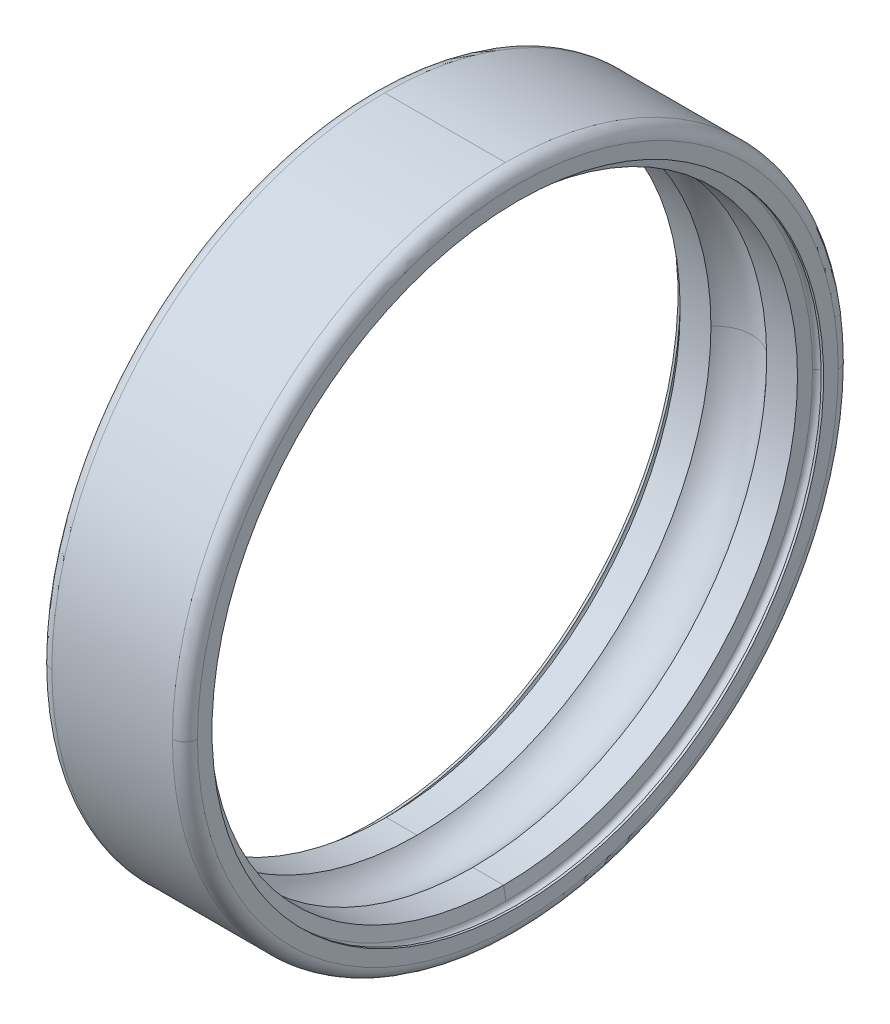
ISO-10303-21;
HEADER;
FILE_DESCRIPTION(('STEP AP214'),'2;1');
FILE_NAME('part.step','',(''),(''),'','','');
FILE_SCHEMA(('AUTOMOTIVE_DESIGN { 1 0 10303 214 1 1 1 1 }'));
ENDSEC;
DATA;
#1=APPLICATION_CONTEXT('core data for automotive mechanical design processes');
#2=APPLICATION_PROTOCOL_DEFINITION('international standard','automotive_design',2000,#1);
#3=PRODUCT_CONTEXT('',#1,'mechanical');
#4=PRODUCT('Part','Part','',(#3));
#5=PRODUCT_RELATED_PRODUCT_CATEGORY('part','',(#4));
#6=PRODUCT_DEFINITION_FORMATION('','',#4);
#7=PRODUCT_DEFINITION_CONTEXT('part definition',#1,'design');
#8=PRODUCT_DEFINITION('design','',#6,#7);
#9=PRODUCT_DEFINITION_SHAPE('','',#8);
#10=(LENGTH_UNIT() NAMED_UNIT(*) SI_UNIT(.MILLI.,.METRE.));
#11=(NAMED_UNIT(*) PLANE_ANGLE_UNIT() SI_UNIT($,.RADIAN.));
#12=(NAMED_UNIT(*) SI_UNIT($,.STERADIAN.) SOLID_ANGLE_UNIT());
#13=UNCERTAINTY_MEASURE_WITH_UNIT(LENGTH_MEASURE(1.E-05),#10,'distance_accuracy_value','');
#14=(GEOMETRIC_REPRESENTATION_CONTEXT(3) GLOBAL_UNCERTAINTY_ASSIGNED_CONTEXT((#13)) GLOBAL_UNIT_ASSIGNED_CONTEXT((#10,
#11,#12)) REPRESENTATION_CONTEXT('',''));
#15=CARTESIAN_POINT('',(0.,0.,0.));
#16=DIRECTION('',(0.,0.,1.));
#17=DIRECTION('',(1.,0.,0.));
#18=AXIS2_PLACEMENT_3D('',#15,#16,#17);
#19=CARTESIAN_POINT('',(6.37427904108305,0.,0.));
#20=DIRECTION('',(1.,0.,0.));
#21=DIRECTION('',(0.,1.,0.));
#22=AXIS2_PLACEMENT_3D('',#19,#20,#21);
#23=CONICAL_SURFACE('',#22,14.4324695404317,1.39626340159546);
#24=DIRECTION('',(0.17364817766693,-0.984807753012208,0.));
#25=VECTOR('',#24,1.);
#26=CARTESIAN_POINT('',(6.37427904108305,-14.4324695404317,0.));
#27=LINE('',#26,#25);
#28=CARTESIAN_POINT('',(6.32006386535891,-14.125,0.));
#29=VERTEX_POINT('',#28);
#30=CARTESIAN_POINT('',(6.42849421680719,-14.7399390808634,0.));
#31=VERTEX_POINT('',#30);
#32=EDGE_CURVE('E322',#29,#31,#27,.T.);
#33=ORIENTED_EDGE('',*,*,#32,.F.);
#34=CARTESIAN_POINT('',(6.32006386535891,0.,0.));
#35=DIRECTION('',(1.,0.,0.));
#36=DIRECTION('',(0.,1.,0.));
#37=AXIS2_PLACEMENT_3D('',#34,#35,#36);
#38=CIRCLE('',#37,14.125);
#39=CARTESIAN_POINT('',(6.32006386535891,14.125,0.));
#40=VERTEX_POINT('',#39);
#41=EDGE_CURVE('E201',#40,#29,#38,.T.);
#42=ORIENTED_EDGE('',*,*,#41,.F.);
#43=DIRECTION('',(0.17364817766693,0.984807753012208,0.));
#44=VECTOR('',#43,1.);
#45=CARTESIAN_POINT('',(6.37427904108305,14.4324695404317,0.));
#46=LINE('',#45,#44);
#47=CARTESIAN_POINT('',(6.42849421680719,14.7399390808634,0.));
#48=VERTEX_POINT('',#47);
#49=EDGE_CURVE('E335',#40,#48,#46,.T.);
#50=ORIENTED_EDGE('',*,*,#49,.T.);
#51=CARTESIAN_POINT('',(6.42849421680719,0.,0.));
#52=DIRECTION('',(1.,0.,0.));
#53=DIRECTION('',(0.,1.,0.));
#54=AXIS2_PLACEMENT_3D('',#51,#52,#53);
#55=CIRCLE('',#54,14.7399390808634);
#56=CARTESIAN_POINT('',(6.42849421680719,0.,14.7399390808634));
#57=VERTEX_POINT('',#56);
#58=EDGE_CURVE('E267',#48,#57,#55,.T.);
#59=ORIENTED_EDGE('',*,*,#58,.T.);
#60=CARTESIAN_POINT('',(6.42849421680719,0.,0.));
#61=DIRECTION('',(1.,0.,0.));
#62=DIRECTION('',(0.,1.,0.));
#63=AXIS2_PLACEMENT_3D('',#60,#61,#62);
#64=CIRCLE('',#63,14.7399390808634);
#65=EDGE_CURVE('E252',#57,#31,#64,.T.);
#66=ORIENTED_EDGE('',*,*,#65,.T.);
#67=EDGE_LOOP('',(#33,#42,#50,#59,#66));
#68=FACE_BOUND('',#67,.T.);
#69=ADVANCED_FACE('F17',(#68),#23,.F.);
#70=CARTESIAN_POINT('',(5.58026976360218,0.,0.));
#71=DIRECTION('',(-1.,0.,0.));
#72=DIRECTION('',(0.,1.,0.));
#73=AXIS2_PLACEMENT_3D('',#70,#71,#72);
#74=CYLINDRICAL_SURFACE('',#73,14.125);
#75=DIRECTION('',(-1.,0.,0.));
#76=VECTOR('',#75,1.);
#77=CARTESIAN_POINT('',(5.58026976360218,-14.125,0.));
#78=LINE('',#77,#76);
#79=CARTESIAN_POINT('',(4.84047566184545,-14.125,0.));
#80=VERTEX_POINT('',#79);
#81=EDGE_CURVE('E271',#29,#80,#78,.T.);
#82=ORIENTED_EDGE('',*,*,#81,.F.);
#83=CARTESIAN_POINT('',(6.32006386535891,0.,0.));
#84=DIRECTION('',(1.,0.,0.));
#85=DIRECTION('',(0.,1.,0.));
#86=AXIS2_PLACEMENT_3D('',#83,#84,#85);
#87=CIRCLE('',#86,14.125);
#88=EDGE_CURVE('E319',#29,#40,#87,.T.);
#89=ORIENTED_EDGE('',*,*,#88,.T.);
#90=DIRECTION('',(-1.,0.,0.));
#91=VECTOR('',#90,1.);
#92=CARTESIAN_POINT('',(5.58026976360218,14.125,0.));
#93=LINE('',#92,#91);
#94=CARTESIAN_POINT('',(4.84047566184545,14.125,0.));
#95=VERTEX_POINT('',#94);
#96=EDGE_CURVE('E242',#40,#95,#93,.T.);
#97=ORIENTED_EDGE('',*,*,#96,.T.);
#98=CARTESIAN_POINT('',(4.84047566184545,0.,0.));
#99=DIRECTION('',(1.,0.,0.));
#100=DIRECTION('',(0.,1.,0.));
#101=AXIS2_PLACEMENT_3D('',#98,#99,#100);
#102=CIRCLE('',#101,14.125);
#103=CARTESIAN_POINT('',(4.84047566184545,0.,-14.125));
#104=VERTEX_POINT('',#103);
#105=EDGE_CURVE('E11',#104,#95,#102,.T.);
#106=ORIENTED_EDGE('',*,*,#105,.F.);
#107=CARTESIAN_POINT('',(4.84047566184545,0.,0.));
#108=DIRECTION('',(1.,0.,0.));
#109=DIRECTION('',(0.,1.,0.));
#110=AXIS2_PLACEMENT_3D('',#107,#108,#109);
#111=CIRCLE('',#110,14.125);
#112=EDGE_CURVE('E359',#80,#104,#111,.T.);
#113=ORIENTED_EDGE('',*,*,#112,.F.);
#114=EDGE_LOOP('',(#82,#89,#97,#106,#113));
#115=FACE_BOUND('',#114,.T.);
#116=ADVANCED_FACE('F735',(#115),#74,.F.);
#117=CARTESIAN_POINT('',(3.5,0.,0.));
#118=DIRECTION('',(1.,0.,0.));
#119=DIRECTION('',(0.,0.,-1.));
#120=AXIS2_PLACEMENT_3D('',#117,#118,#119);
#121=TOROIDAL_SURFACE('',#120,13.,1.75);
#122=CARTESIAN_POINT('',(3.5,0.,13.));
#123=DIRECTION('',(0.,1.,0.));
#124=DIRECTION('',(0.,0.,1.));
#125=AXIS2_PLACEMENT_3D('',#122,#123,#124);
#126=CIRCLE('',#125,1.75);
#127=CARTESIAN_POINT('',(2.15952433815455,0.,14.125));
#128=VERTEX_POINT('',#127);
#129=CARTESIAN_POINT('',(4.84047566184545,0.,14.125));
#130=VERTEX_POINT('',#129);
#131=EDGE_CURVE('E355',#128,#130,#126,.T.);
#132=ORIENTED_EDGE('',*,*,#131,.F.);
#133=CARTESIAN_POINT('',(2.15952433815455,0.,0.));
#134=DIRECTION('',(1.,0.,0.));
#135=DIRECTION('',(0.,1.,0.));
#136=AXIS2_PLACEMENT_3D('',#133,#134,#135);
#137=CIRCLE('',#136,14.125);
#138=CARTESIAN_POINT('',(2.15952433815455,14.125,0.));
#139=VERTEX_POINT('',#138);
#140=EDGE_CURVE('E262',#139,#128,#137,.T.);
#141=ORIENTED_EDGE('',*,*,#140,.F.);
#142=CARTESIAN_POINT('',(2.15952433815455,0.,0.));
#143=DIRECTION('',(1.,0.,0.));
#144=DIRECTION('',(0.,1.,0.));
#145=AXIS2_PLACEMENT_3D('',#142,#143,#144);
#146=CIRCLE('',#145,14.125);
#147=CARTESIAN_POINT('',(2.15952433815455,0.,-14.125));
#148=VERTEX_POINT('',#147);
#149=EDGE_CURVE('E28',#148,#139,#146,.T.);
#150=ORIENTED_EDGE('',*,*,#149,.F.);
#151=CARTESIAN_POINT('',(3.5,0.,-13.));
#152=DIRECTION('',(0.,-1.,0.));
#153=DIRECTION('',(0.,0.,-1.));
#154=AXIS2_PLACEMENT_3D('',#151,#152,#153);
#155=CIRCLE('',#154,1.75);
#156=EDGE_CURVE('E363',#148,#104,#155,.T.);
#157=ORIENTED_EDGE('',*,*,#156,.T.);
#158=ORIENTED_EDGE('',*,*,#105,.T.);
#159=CARTESIAN_POINT('',(4.84047566184545,0.,0.));
#160=DIRECTION('',(1.,0.,0.));
#161=DIRECTION('',(0.,1.,0.));
#162=AXIS2_PLACEMENT_3D('',#159,#160,#161);
#163=CIRCLE('',#162,14.125);
#164=EDGE_CURVE('E238',#95,#130,#163,.T.);
#165=ORIENTED_EDGE('',*,*,#164,.T.);
#166=EDGE_LOOP('',(#132,#141,#150,#157,#158,#165));
#167=FACE_BOUND('',#166,.T.);
#168=ADVANCED_FACE('F739',(#167),#121,.F.);
#169=CARTESIAN_POINT('',(1.41973023639782,0.,0.));
#170=DIRECTION('',(-1.,0.,0.));
#171=DIRECTION('',(0.,1.,0.));
#172=AXIS2_PLACEMENT_3D('',#169,#170,#171);
#173=CYLINDRICAL_SURFACE('',#172,14.125);
#174=DIRECTION('',(-1.,0.,0.));
#175=VECTOR('',#174,1.);
#176=CARTESIAN_POINT('',(1.41973023639782,-14.125,0.));
#177=LINE('',#176,#175);
#178=CARTESIAN_POINT('',(2.15952433815455,-14.125,0.));
#179=VERTEX_POINT('',#178);
#180=CARTESIAN_POINT('',(0.679936134641088,-14.125,0.));
#181=VERTEX_POINT('',#180);
#182=EDGE_CURVE('E264',#179,#181,#177,.T.);
#183=ORIENTED_EDGE('',*,*,#182,.F.);
#184=CARTESIAN_POINT('',(2.15952433815455,0.,0.));
#185=DIRECTION('',(1.,0.,0.));
#186=DIRECTION('',(0.,1.,0.));
#187=AXIS2_PLACEMENT_3D('',#184,#185,#186);
#188=CIRCLE('',#187,14.125);
#189=EDGE_CURVE('E265',#179,#148,#188,.T.);
#190=ORIENTED_EDGE('',*,*,#189,.T.);
#191=ORIENTED_EDGE('',*,*,#149,.T.);
#192=DIRECTION('',(-1.,0.,0.));
#193=VECTOR('',#192,1.);
#194=CARTESIAN_POINT('',(1.41973023639782,14.125,0.));
#195=LINE('',#194,#193);
#196=CARTESIAN_POINT('',(0.679936134641088,14.125,0.));
#197=VERTEX_POINT('',#196);
#198=EDGE_CURVE('E305',#139,#197,#195,.T.);
#199=ORIENTED_EDGE('',*,*,#198,.T.);
#200=CARTESIAN_POINT('',(0.679936134641088,0.,0.));
#201=DIRECTION('',(1.,0.,0.));
#202=DIRECTION('',(0.,1.,0.));
#203=AXIS2_PLACEMENT_3D('',#200,#201,#202);
#204=CIRCLE('',#203,14.125);
#205=EDGE_CURVE('E236',#181,#197,#204,.T.);
#206=ORIENTED_EDGE('',*,*,#205,.F.);
#207=EDGE_LOOP('',(#183,#190,#191,#199,#206));
#208=FACE_BOUND('',#207,.T.);
#209=ADVANCED_FACE('F435',(#208),#173,.F.);
#210=CARTESIAN_POINT('',(0.625720958916948,0.,0.));
#211=DIRECTION('',(-1.,0.,0.));
#212=DIRECTION('',(0.,1.,0.));
#213=AXIS2_PLACEMENT_3D('',#210,#211,#212);
#214=CONICAL_SURFACE('',#213,14.4324695404317,1.39626340159546);
#215=DIRECTION('',(-0.173648177666931,-0.984807753012208,0.));
#216=VECTOR('',#215,1.);
#217=CARTESIAN_POINT('',(0.625720958916948,-14.4324695404317,0.));
#218=LINE('',#217,#216);
#219=CARTESIAN_POINT('',(0.571505783192808,-14.7399390808634,0.));
#220=VERTEX_POINT('',#219);
#221=EDGE_CURVE('E369',#181,#220,#218,.T.);
#222=ORIENTED_EDGE('',*,*,#221,.F.);
#223=ORIENTED_EDGE('',*,*,#205,.T.);
#224=DIRECTION('',(-0.173648177666931,0.984807753012208,0.));
#225=VECTOR('',#224,1.);
#226=CARTESIAN_POINT('',(0.625720958916948,14.4324695404317,0.));
#227=LINE('',#226,#225);
#228=CARTESIAN_POINT('',(0.571505783192808,14.7399390808634,0.));
#229=VERTEX_POINT('',#228);
#230=EDGE_CURVE('E213',#197,#229,#227,.T.);
#231=ORIENTED_EDGE('',*,*,#230,.T.);
#232=CARTESIAN_POINT('',(0.571505783192808,0.,0.));
#233=DIRECTION('',(1.,0.,0.));
#234=DIRECTION('',(0.,1.,0.));
#235=AXIS2_PLACEMENT_3D('',#232,#233,#234);
#236=CIRCLE('',#235,14.7399390808634);
#237=CARTESIAN_POINT('',(0.571505783192808,0.,-14.7399390808634));
#238=VERTEX_POINT('',#237);
#239=EDGE_CURVE('E232',#238,#229,#236,.T.);
#240=ORIENTED_EDGE('',*,*,#239,.F.);
#241=CARTESIAN_POINT('',(0.571505783192808,0.,0.));
#242=DIRECTION('',(1.,0.,0.));
#243=DIRECTION('',(0.,1.,0.));
#244=AXIS2_PLACEMENT_3D('',#241,#242,#243);
#245=CIRCLE('',#244,14.7399390808634);
#246=EDGE_CURVE('E354',#220,#238,#245,.T.);
#247=ORIENTED_EDGE('',*,*,#246,.F.);
#248=EDGE_LOOP('',(#222,#223,#231,#240,#247));
#249=FACE_BOUND('',#248,.T.);
#250=ADVANCED_FACE('F489',(#249),#214,.F.);
#251=CARTESIAN_POINT('',(0.345,0.,0.));
#252=DIRECTION('',(1.,0.,0.));
#253=DIRECTION('',(0.,0.,-1.));
#254=AXIS2_PLACEMENT_3D('',#251,#252,#253);
#255=TOROIDAL_SURFACE('',#254,14.7,0.23);
#256=CARTESIAN_POINT('',(0.345,0.,14.7));
#257=DIRECTION('',(0.,1.,0.));
#258=DIRECTION('',(0.,0.,1.));
#259=AXIS2_PLACEMENT_3D('',#256,#257,#258);
#260=CIRCLE('',#259,0.23);
#261=CARTESIAN_POINT('',(0.115,0.,14.7));
#262=VERTEX_POINT('',#261);
#263=CARTESIAN_POINT('',(0.571505783192808,0.,14.7399390808634));
#264=VERTEX_POINT('',#263);
#265=EDGE_CURVE('E212',#262,#264,#260,.T.);
#266=ORIENTED_EDGE('',*,*,#265,.F.);
#267=CARTESIAN_POINT('',(0.115,0.,0.));
#268=DIRECTION('',(1.,0.,0.));
#269=DIRECTION('',(0.,1.,0.));
#270=AXIS2_PLACEMENT_3D('',#267,#268,#269);
#271=CIRCLE('',#270,14.7);
#272=CARTESIAN_POINT('',(0.115,14.7,0.));
#273=VERTEX_POINT('',#272);
#274=EDGE_CURVE('E243',#273,#262,#271,.T.);
#275=ORIENTED_EDGE('',*,*,#274,.F.);
#276=CARTESIAN_POINT('',(0.115,0.,0.));
#277=DIRECTION('',(1.,0.,0.));
#278=DIRECTION('',(0.,1.,0.));
#279=AXIS2_PLACEMENT_3D('',#276,#277,#278);
#280=CIRCLE('',#279,14.7);
#281=CARTESIAN_POINT('',(0.115,0.,-14.7));
#282=VERTEX_POINT('',#281);
#283=EDGE_CURVE('E237',#282,#273,#280,.T.);
#284=ORIENTED_EDGE('',*,*,#283,.F.);
#285=CARTESIAN_POINT('',(0.345,0.,-14.7));
#286=DIRECTION('',(0.,-1.,0.));
#287=DIRECTION('',(0.,0.,-1.));
#288=AXIS2_PLACEMENT_3D('',#285,#286,#287);
#289=CIRCLE('',#288,0.23);
#290=EDGE_CURVE('E429',#282,#238,#289,.T.);
#291=ORIENTED_EDGE('',*,*,#290,.T.);
#292=ORIENTED_EDGE('',*,*,#239,.T.);
#293=CARTESIAN_POINT('',(0.571505783192808,0.,0.));
#294=DIRECTION('',(1.,0.,0.));
#295=DIRECTION('',(0.,1.,0.));
#296=AXIS2_PLACEMENT_3D('',#293,#294,#295);
#297=CIRCLE('',#296,14.7399390808634);
#298=EDGE_CURVE('E214',#229,#264,#297,.T.);
#299=ORIENTED_EDGE('',*,*,#298,.T.);
#300=EDGE_LOOP('',(#266,#275,#284,#291,#292,#299));
#301=FACE_BOUND('',#300,.T.);
#302=ADVANCED_FACE('F494',(#301),#255,.F.);
#303=CARTESIAN_POINT('',(0.0575,0.,0.));
#304=DIRECTION('',(-1.,0.,0.));
#305=DIRECTION('',(0.,1.,0.));
#306=AXIS2_PLACEMENT_3D('',#303,#304,#305);
#307=CYLINDRICAL_SURFACE('',#306,14.7);
#308=DIRECTION('',(-1.,0.,0.));
#309=VECTOR('',#308,1.);
#310=CARTESIAN_POINT('',(0.0575,-14.7,0.));
#311=LINE('',#310,#309);
#312=CARTESIAN_POINT('',(0.115,-14.7,0.));
#313=VERTEX_POINT('',#312);
#314=CARTESIAN_POINT('',(0.,-14.7,0.));
#315=VERTEX_POINT('',#314);
#316=EDGE_CURVE('E247',#313,#315,#311,.T.);
#317=ORIENTED_EDGE('',*,*,#316,.F.);
#318=CARTESIAN_POINT('',(0.115,0.,0.));
#319=DIRECTION('',(1.,0.,0.));
#320=DIRECTION('',(0.,1.,0.));
#321=AXIS2_PLACEMENT_3D('',#318,#319,#320);
#322=CIRCLE('',#321,14.7);
#323=EDGE_CURVE('E248',#313,#282,#322,.T.);
#324=ORIENTED_EDGE('',*,*,#323,.T.);
#325=ORIENTED_EDGE('',*,*,#283,.T.);
#326=DIRECTION('',(-1.,0.,0.));
#327=VECTOR('',#326,1.);
#328=CARTESIAN_POINT('',(0.0575,14.7,0.));
#329=LINE('',#328,#327);
#330=CARTESIAN_POINT('',(0.,14.7,0.));
#331=VERTEX_POINT('',#330);
#332=EDGE_CURVE('E257',#273,#331,#329,.T.);
#333=ORIENTED_EDGE('',*,*,#332,.T.);
#334=CARTESIAN_POINT('',(0.,0.,0.));
#335=DIRECTION('',(1.,0.,0.));
#336=DIRECTION('',(0.,1.,0.));
#337=AXIS2_PLACEMENT_3D('',#334,#335,#336);
#338=CIRCLE('',#337,14.7);
#339=EDGE_CURVE('E275',#315,#331,#338,.T.);
#340=ORIENTED_EDGE('',*,*,#339,.F.);
#341=EDGE_LOOP('',(#317,#324,#325,#333,#340));
#342=FACE_BOUND('',#341,.T.);
#343=ADVANCED_FACE('F752',(#342),#307,.F.);
#344=CARTESIAN_POINT('',(0.,15.05,0.));
#345=DIRECTION('',(-1.,0.,0.));
#346=DIRECTION('',(0.,0.,1.));
#347=AXIS2_PLACEMENT_3D('',#344,#345,#346);
#348=PLANE('',#347);
#349=CARTESIAN_POINT('',(0.,0.,0.));
#350=DIRECTION('',(1.,0.,0.));
#351=DIRECTION('',(0.,1.,0.));
#352=AXIS2_PLACEMENT_3D('',#349,#350,#351);
#353=CIRCLE('',#352,14.7);
#354=EDGE_CURVE('E261',#331,#315,#353,.T.);
#355=ORIENTED_EDGE('',*,*,#354,.T.);
#356=ORIENTED_EDGE('',*,*,#339,.T.);
#357=EDGE_LOOP('',(#355,#356));
#358=FACE_BOUND('',#357,.T.);
#359=CARTESIAN_POINT('',(0.,0.,0.));
#360=DIRECTION('',(1.,0.,0.));
#361=DIRECTION('',(0.,1.,0.));
#362=AXIS2_PLACEMENT_3D('',#359,#360,#361);
#363=CIRCLE('',#362,15.4);
#364=CARTESIAN_POINT('',(0.,0.,-15.4));
#365=VERTEX_POINT('',#364);
#366=CARTESIAN_POINT('',(0.,0.,15.4));
#367=VERTEX_POINT('',#366);
#368=EDGE_CURVE('E197',#365,#367,#363,.T.);
#369=ORIENTED_EDGE('',*,*,#368,.F.);
#370=CARTESIAN_POINT('',(0.,0.,0.));
#371=DIRECTION('',(1.,0.,0.));
#372=DIRECTION('',(0.,1.,0.));
#373=AXIS2_PLACEMENT_3D('',#370,#371,#372);
#374=CIRCLE('',#373,15.4);
#375=EDGE_CURVE('E226',#367,#365,#374,.T.);
#376=ORIENTED_EDGE('',*,*,#375,.F.);
#377=EDGE_LOOP('',(#369,#376));
#378=FACE_BOUND('',#377,.T.);
#379=ADVANCED_FACE('F756',(#358,#378),#348,.T.);
#380=CARTESIAN_POINT('',(0.6,0.,0.));
#381=DIRECTION('',(1.,0.,0.));
#382=DIRECTION('',(0.,0.,-1.));
#383=AXIS2_PLACEMENT_3D('',#380,#381,#382);
#384=TOROIDAL_SURFACE('',#383,15.4,0.6);
#385=CARTESIAN_POINT('',(0.6,0.,15.4));
#386=DIRECTION('',(0.,1.,0.));
#387=DIRECTION('',(0.,0.,1.));
#388=AXIS2_PLACEMENT_3D('',#385,#386,#387);
#389=CIRCLE('',#388,0.6);
#390=CARTESIAN_POINT('',(0.6,0.,16.));
#391=VERTEX_POINT('',#390);
#392=EDGE_CURVE('E189',#367,#391,#389,.T.);
#393=ORIENTED_EDGE('',*,*,#392,.F.);
#394=ORIENTED_EDGE('',*,*,#375,.T.);
#395=CARTESIAN_POINT('',(0.6,0.,-15.4));
#396=DIRECTION('',(0.,-1.,0.));
#397=DIRECTION('',(0.,0.,-1.));
#398=AXIS2_PLACEMENT_3D('',#395,#396,#397);
#399=CIRCLE('',#398,0.6);
#400=CARTESIAN_POINT('',(0.6,0.,-16.));
#401=VERTEX_POINT('',#400);
#402=EDGE_CURVE('E184',#365,#401,#399,.T.);
#403=ORIENTED_EDGE('',*,*,#402,.T.);
#404=CARTESIAN_POINT('',(0.6,0.,0.));
#405=DIRECTION('',(1.,0.,0.));
#406=DIRECTION('',(0.,1.,0.));
#407=AXIS2_PLACEMENT_3D('',#404,#405,#406);
#408=CIRCLE('',#407,16.);
#409=CARTESIAN_POINT('',(0.6,-16.,0.));
#410=VERTEX_POINT('',#409);
#411=EDGE_CURVE('E172',#410,#401,#408,.T.);
#412=ORIENTED_EDGE('',*,*,#411,.F.);
#413=CARTESIAN_POINT('',(0.6,0.,0.));
#414=DIRECTION('',(1.,0.,0.));
#415=DIRECTION('',(0.,1.,0.));
#416=AXIS2_PLACEMENT_3D('',#413,#414,#415);
#417=CIRCLE('',#416,16.);
#418=EDGE_CURVE('E222',#391,#410,#417,.T.);
#419=ORIENTED_EDGE('',*,*,#418,.F.);
#420=EDGE_LOOP('',(#393,#394,#403,#412,#419));
#421=FACE_BOUND('',#420,.T.);
#422=ADVANCED_FACE('F773',(#421),#384,.T.);
#423=CARTESIAN_POINT('',(3.5,0.,0.));
#424=DIRECTION('',(-1.,0.,0.));
#425=DIRECTION('',(0.,1.,0.));
#426=AXIS2_PLACEMENT_3D('',#423,#424,#425);
#427=CYLINDRICAL_SURFACE('',#426,16.);
#428=DIRECTION('',(-1.,0.,0.));
#429=VECTOR('',#428,1.);
#430=CARTESIAN_POINT('',(3.5,-16.,0.));
#431=LINE('',#430,#429);
#432=CARTESIAN_POINT('',(6.4,-16.,0.));
#433=VERTEX_POINT('',#432);
#434=EDGE_CURVE('E347',#433,#410,#431,.T.);
#435=ORIENTED_EDGE('',*,*,#434,.F.);
#436=CARTESIAN_POINT('',(6.4,0.,0.));
#437=DIRECTION('',(1.,0.,0.));
#438=DIRECTION('',(0.,1.,0.));
#439=AXIS2_PLACEMENT_3D('',#436,#437,#438);
#440=CIRCLE('',#439,16.);
#441=CARTESIAN_POINT('',(6.4,0.,16.));
#442=VERTEX_POINT('',#441);
#443=EDGE_CURVE('E219',#442,#433,#440,.T.);
#444=ORIENTED_EDGE('',*,*,#443,.F.);
#445=CARTESIAN_POINT('',(6.4,0.,0.));
#446=DIRECTION('',(1.,0.,0.));
#447=DIRECTION('',(0.,1.,0.));
#448=AXIS2_PLACEMENT_3D('',#445,#446,#447);
#449=CIRCLE('',#448,16.);
#450=CARTESIAN_POINT('',(6.4,16.,0.));
#451=VERTEX_POINT('',#450);
#452=EDGE_CURVE('E166',#451,#442,#449,.T.);
#453=ORIENTED_EDGE('',*,*,#452,.F.);
#454=DIRECTION('',(-1.,0.,0.));
#455=VECTOR('',#454,1.);
#456=CARTESIAN_POINT('',(3.5,16.,0.));
#457=LINE('',#456,#455);
#458=CARTESIAN_POINT('',(0.6,16.,0.));
#459=VERTEX_POINT('',#458);
#460=EDGE_CURVE('E158',#451,#459,#457,.T.);
#461=ORIENTED_EDGE('',*,*,#460,.T.);
#462=CARTESIAN_POINT('',(0.6,0.,0.));
#463=DIRECTION('',(1.,0.,0.));
#464=DIRECTION('',(0.,1.,0.));
#465=AXIS2_PLACEMENT_3D('',#462,#463,#464);
#466=CIRCLE('',#465,16.);
#467=EDGE_CURVE('E163',#459,#391,#466,.T.);
#468=ORIENTED_EDGE('',*,*,#467,.T.);
#469=ORIENTED_EDGE('',*,*,#418,.T.);
#470=EDGE_LOOP('',(#435,#444,#453,#461,#468,#469));
#471=FACE_BOUND('',#470,.T.);
#472=ADVANCED_FACE('F161',(#471),#427,.T.);
#473=CARTESIAN_POINT('',(6.4,0.,0.));
#474=DIRECTION('',(1.,0.,0.));
#475=DIRECTION('',(0.,0.,-1.));
#476=AXIS2_PLACEMENT_3D('',#473,#474,#475);
#477=TOROIDAL_SURFACE('',#476,15.4,0.6);
#478=CARTESIAN_POINT('',(6.4,0.,15.4));
#479=DIRECTION('',(0.,1.,0.));
#480=DIRECTION('',(0.,0.,1.));
#481=AXIS2_PLACEMENT_3D('',#478,#479,#480);
#482=CIRCLE('',#481,0.6);
#483=CARTESIAN_POINT('',(7.,0.,15.4));
#484=VERTEX_POINT('',#483);
#485=EDGE_CURVE('E207',#442,#484,#482,.T.);
#486=ORIENTED_EDGE('',*,*,#485,.F.);
#487=ORIENTED_EDGE('',*,*,#443,.T.);
#488=CARTESIAN_POINT('',(6.4,0.,0.));
#489=DIRECTION('',(1.,0.,0.));
#490=DIRECTION('',(0.,1.,0.));
#491=AXIS2_PLACEMENT_3D('',#488,#489,#490);
#492=CIRCLE('',#491,16.);
#493=CARTESIAN_POINT('',(6.4,0.,-16.));
#494=VERTEX_POINT('',#493);
#495=EDGE_CURVE('E289',#433,#494,#492,.T.);
#496=ORIENTED_EDGE('',*,*,#495,.T.);
#497=CARTESIAN_POINT('',(6.4,0.,-15.4));
#498=DIRECTION('',(0.,-1.,0.));
#499=DIRECTION('',(0.,0.,-1.));
#500=AXIS2_PLACEMENT_3D('',#497,#498,#499);
#501=CIRCLE('',#500,0.6);
#502=CARTESIAN_POINT('',(7.,0.,-15.4));
#503=VERTEX_POINT('',#502);
#504=EDGE_CURVE('E206',#494,#503,#501,.T.);
#505=ORIENTED_EDGE('',*,*,#504,.T.);
#506=CARTESIAN_POINT('',(7.,0.,0.));
#507=DIRECTION('',(1.,0.,0.));
#508=DIRECTION('',(0.,1.,0.));
#509=AXIS2_PLACEMENT_3D('',#506,#507,#508);
#510=CIRCLE('',#509,15.4);
#511=EDGE_CURVE('E223',#484,#503,#510,.T.);
#512=ORIENTED_EDGE('',*,*,#511,.F.);
#513=EDGE_LOOP('',(#486,#487,#496,#505,#512));
#514=FACE_BOUND('',#513,.T.);
#515=ADVANCED_FACE('F566',(#514),#477,.T.);
#516=CARTESIAN_POINT('',(7.,15.05,0.));
#517=DIRECTION('',(1.,0.,0.));
#518=DIRECTION('',(0.,1.,0.));
#519=AXIS2_PLACEMENT_3D('',#516,#517,#518);
#520=PLANE('',#519);
#521=CARTESIAN_POINT('',(7.,0.,0.));
#522=DIRECTION('',(1.,0.,0.));
#523=DIRECTION('',(0.,1.,0.));
#524=AXIS2_PLACEMENT_3D('',#521,#522,#523);
#525=CIRCLE('',#524,14.7);
#526=CARTESIAN_POINT('',(7.,14.7,0.));
#527=VERTEX_POINT('',#526);
#528=CARTESIAN_POINT('',(7.,-14.7,0.));
#529=VERTEX_POINT('',#528);
#530=EDGE_CURVE('E227',#527,#529,#525,.T.);
#531=ORIENTED_EDGE('',*,*,#530,.F.);
#532=CARTESIAN_POINT('',(7.,0.,0.));
#533=DIRECTION('',(1.,0.,0.));
#534=DIRECTION('',(0.,1.,0.));
#535=AXIS2_PLACEMENT_3D('',#532,#533,#534);
#536=CIRCLE('',#535,14.7);
#537=EDGE_CURVE('E279',#529,#527,#536,.T.);
#538=ORIENTED_EDGE('',*,*,#537,.F.);
#539=EDGE_LOOP('',(#531,#538));
#540=FACE_BOUND('',#539,.T.);
#541=CARTESIAN_POINT('',(7.,0.,0.));
#542=DIRECTION('',(1.,0.,0.));
#543=DIRECTION('',(0.,1.,0.));
#544=AXIS2_PLACEMENT_3D('',#541,#542,#543);
#545=CIRCLE('',#544,15.4);
#546=EDGE_CURVE('E203',#503,#484,#545,.T.);
#547=ORIENTED_EDGE('',*,*,#546,.T.);
#548=ORIENTED_EDGE('',*,*,#511,.T.);
#549=EDGE_LOOP('',(#547,#548));
#550=FACE_BOUND('',#549,.T.);
#551=ADVANCED_FACE('F563',(#540,#550),#520,.T.);
#552=CARTESIAN_POINT('',(6.9425,0.,0.));
#553=DIRECTION('',(-1.,0.,0.));
#554=DIRECTION('',(0.,1.,0.));
#555=AXIS2_PLACEMENT_3D('',#552,#553,#554);
#556=CYLINDRICAL_SURFACE('',#555,14.7);
#557=DIRECTION('',(-1.,0.,0.));
#558=VECTOR('',#557,1.);
#559=CARTESIAN_POINT('',(6.9425,-14.7,0.));
#560=LINE('',#559,#558);
#561=CARTESIAN_POINT('',(6.885,-14.7,0.));
#562=VERTEX_POINT('',#561);
#563=EDGE_CURVE('E231',#529,#562,#560,.T.);
#564=ORIENTED_EDGE('',*,*,#563,.F.);
#565=ORIENTED_EDGE('',*,*,#537,.T.);
#566=DIRECTION('',(-1.,0.,0.));
#567=VECTOR('',#566,1.);
#568=CARTESIAN_POINT('',(6.9425,14.7,0.));
#569=LINE('',#568,#567);
#570=CARTESIAN_POINT('',(6.885,14.7,0.));
#571=VERTEX_POINT('',#570);
#572=EDGE_CURVE('E249',#527,#571,#569,.T.);
#573=ORIENTED_EDGE('',*,*,#572,.T.);
#574=CARTESIAN_POINT('',(6.885,0.,0.));
#575=DIRECTION('',(1.,0.,0.));
#576=DIRECTION('',(0.,1.,0.));
#577=AXIS2_PLACEMENT_3D('',#574,#575,#576);
#578=CIRCLE('',#577,14.7);
#579=CARTESIAN_POINT('',(6.885,0.,-14.7));
#580=VERTEX_POINT('',#579);
#581=EDGE_CURVE('E43',#580,#571,#578,.T.);
#582=ORIENTED_EDGE('',*,*,#581,.F.);
#583=CARTESIAN_POINT('',(6.885,0.,0.));
#584=DIRECTION('',(1.,0.,0.));
#585=DIRECTION('',(0.,1.,0.));
#586=AXIS2_PLACEMENT_3D('',#583,#584,#585);
#587=CIRCLE('',#586,14.7);
#588=EDGE_CURVE('E387',#562,#580,#587,.T.);
#589=ORIENTED_EDGE('',*,*,#588,.F.);
#590=EDGE_LOOP('',(#564,#565,#573,#582,#589));
#591=FACE_BOUND('',#590,.T.);
#592=ADVANCED_FACE('F557',(#591),#556,.F.);
#593=CARTESIAN_POINT('',(6.655,0.,0.));
#594=DIRECTION('',(1.,0.,0.));
#595=DIRECTION('',(0.,0.,-1.));
#596=AXIS2_PLACEMENT_3D('',#593,#594,#595);
#597=TOROIDAL_SURFACE('',#596,14.7,0.23);
#598=CARTESIAN_POINT('',(6.655,0.,14.7));
#599=DIRECTION('',(0.,1.,0.));
#600=DIRECTION('',(0.,0.,1.));
#601=AXIS2_PLACEMENT_3D('',#598,#599,#600);
#602=CIRCLE('',#601,0.23);
#603=CARTESIAN_POINT('',(6.885,0.,14.7));
#604=VERTEX_POINT('',#603);
#605=EDGE_CURVE('E421',#57,#604,#602,.T.);
#606=ORIENTED_EDGE('',*,*,#605,.F.);
#607=ORIENTED_EDGE('',*,*,#58,.F.);
#608=CARTESIAN_POINT('',(6.42849421680719,0.,0.));
#609=DIRECTION('',(1.,0.,0.));
#610=DIRECTION('',(0.,1.,0.));
#611=AXIS2_PLACEMENT_3D('',#608,#609,#610);
#612=CIRCLE('',#611,14.7399390808634);
#613=CARTESIAN_POINT('',(6.42849421680719,0.,-14.7399390808634));
#614=VERTEX_POINT('',#613);
#615=EDGE_CURVE('E326',#614,#48,#612,.T.);
#616=ORIENTED_EDGE('',*,*,#615,.F.);
#617=CARTESIAN_POINT('',(6.655,0.,-14.7));
#618=DIRECTION('',(0.,-1.,0.));
#619=DIRECTION('',(0.,0.,-1.));
#620=AXIS2_PLACEMENT_3D('',#617,#618,#619);
#621=CIRCLE('',#620,0.23);
#622=EDGE_CURVE('E270',#614,#580,#621,.T.);
#623=ORIENTED_EDGE('',*,*,#622,.T.);
#624=ORIENTED_EDGE('',*,*,#581,.T.);
#625=CARTESIAN_POINT('',(6.885,0.,0.));
#626=DIRECTION('',(1.,0.,0.));
#627=DIRECTION('',(0.,1.,0.));
#628=AXIS2_PLACEMENT_3D('',#625,#626,#627);
#629=CIRCLE('',#628,14.7);
#630=EDGE_CURVE('E253',#571,#604,#629,.T.);
#631=ORIENTED_EDGE('',*,*,#630,.T.);
#632=EDGE_LOOP('',(#606,#607,#616,#623,#624,#631));
#633=FACE_BOUND('',#632,.T.);
#634=ADVANCED_FACE('F792',(#633),#597,.F.);
#635=CARTESIAN_POINT('',(6.655,0.,0.));
#636=DIRECTION('',(1.,0.,0.));
#637=DIRECTION('',(0.,0.,-1.));
#638=AXIS2_PLACEMENT_3D('',#635,#636,#637);
#639=TOROIDAL_SURFACE('',#638,14.7,0.23);
#640=ORIENTED_EDGE('',*,*,#65,.F.);
#641=ORIENTED_EDGE('',*,*,#605,.T.);
#642=CARTESIAN_POINT('',(6.885,0.,0.));
#643=DIRECTION('',(1.,0.,0.));
#644=DIRECTION('',(0.,1.,0.));
#645=AXIS2_PLACEMENT_3D('',#642,#643,#644);
#646=CIRCLE('',#645,14.7);
#647=EDGE_CURVE('E318',#604,#562,#646,.T.);
#648=ORIENTED_EDGE('',*,*,#647,.T.);
#649=ORIENTED_EDGE('',*,*,#588,.T.);
#650=ORIENTED_EDGE('',*,*,#622,.F.);
#651=CARTESIAN_POINT('',(6.42849421680719,0.,0.));
#652=DIRECTION('',(1.,0.,0.));
#653=DIRECTION('',(0.,1.,0.));
#654=AXIS2_PLACEMENT_3D('',#651,#652,#653);
#655=CIRCLE('',#654,14.7399390808634);
#656=EDGE_CURVE('E323',#31,#614,#655,.T.);
#657=ORIENTED_EDGE('',*,*,#656,.F.);
#658=EDGE_LOOP('',(#640,#641,#648,#649,#650,#657));
#659=FACE_BOUND('',#658,.T.);
#660=ADVANCED_FACE('F549',(#659),#639,.F.);
#661=CARTESIAN_POINT('',(6.9425,0.,0.));
#662=DIRECTION('',(-1.,0.,0.));
#663=DIRECTION('',(0.,1.,0.));
#664=AXIS2_PLACEMENT_3D('',#661,#662,#663);
#665=CYLINDRICAL_SURFACE('',#664,14.7);
#666=ORIENTED_EDGE('',*,*,#530,.T.);
#667=ORIENTED_EDGE('',*,*,#563,.T.);
#668=ORIENTED_EDGE('',*,*,#647,.F.);
#669=ORIENTED_EDGE('',*,*,#630,.F.);
#670=ORIENTED_EDGE('',*,*,#572,.F.);
#671=EDGE_LOOP('',(#666,#667,#668,#669,#670));
#672=FACE_BOUND('',#671,.T.);
#673=ADVANCED_FACE('F554',(#672),#665,.F.);
#674=CARTESIAN_POINT('',(6.4,0.,0.));
#675=DIRECTION('',(1.,0.,0.));
#676=DIRECTION('',(0.,0.,-1.));
#677=AXIS2_PLACEMENT_3D('',#674,#675,#676);
#678=TOROIDAL_SURFACE('',#677,15.4,0.6);
#679=CARTESIAN_POINT('',(6.4,0.,0.));
#680=DIRECTION('',(1.,0.,0.));
#681=DIRECTION('',(0.,1.,0.));
#682=AXIS2_PLACEMENT_3D('',#679,#680,#681);
#683=CIRCLE('',#682,16.);
#684=EDGE_CURVE('E171',#494,#451,#683,.T.);
#685=ORIENTED_EDGE('',*,*,#684,.T.);
#686=ORIENTED_EDGE('',*,*,#452,.T.);
#687=ORIENTED_EDGE('',*,*,#485,.T.);
#688=ORIENTED_EDGE('',*,*,#546,.F.);
#689=ORIENTED_EDGE('',*,*,#504,.F.);
#690=EDGE_LOOP('',(#685,#686,#687,#688,#689));
#691=FACE_BOUND('',#690,.T.);
#692=ADVANCED_FACE('F571',(#691),#678,.T.);
#693=CARTESIAN_POINT('',(3.5,0.,0.));
#694=DIRECTION('',(-1.,0.,0.));
#695=DIRECTION('',(0.,1.,0.));
#696=AXIS2_PLACEMENT_3D('',#693,#694,#695);
#697=CYLINDRICAL_SURFACE('',#696,16.);
#698=ORIENTED_EDGE('',*,*,#495,.F.);
#699=ORIENTED_EDGE('',*,*,#434,.T.);
#700=ORIENTED_EDGE('',*,*,#411,.T.);
#701=CARTESIAN_POINT('',(0.6,0.,0.));
#702=DIRECTION('',(1.,0.,0.));
#703=DIRECTION('',(0.,1.,0.));
#704=AXIS2_PLACEMENT_3D('',#701,#702,#703);
#705=CIRCLE('',#704,16.);
#706=EDGE_CURVE('E175',#401,#459,#705,.T.);
#707=ORIENTED_EDGE('',*,*,#706,.T.);
#708=ORIENTED_EDGE('',*,*,#460,.F.);
#709=ORIENTED_EDGE('',*,*,#684,.F.);
#710=EDGE_LOOP('',(#698,#699,#700,#707,#708,#709));
#711=FACE_BOUND('',#710,.T.);
#712=ADVANCED_FACE('F177',(#711),#697,.T.);
#713=CARTESIAN_POINT('',(0.6,0.,0.));
#714=DIRECTION('',(1.,0.,0.));
#715=DIRECTION('',(0.,0.,-1.));
#716=AXIS2_PLACEMENT_3D('',#713,#714,#715);
#717=TOROIDAL_SURFACE('',#716,15.4,0.6);
#718=ORIENTED_EDGE('',*,*,#368,.T.);
#719=ORIENTED_EDGE('',*,*,#392,.T.);
#720=ORIENTED_EDGE('',*,*,#467,.F.);
#721=ORIENTED_EDGE('',*,*,#706,.F.);
#722=ORIENTED_EDGE('',*,*,#402,.F.);
#723=EDGE_LOOP('',(#718,#719,#720,#721,#722));
#724=FACE_BOUND('',#723,.T.);
#725=ADVANCED_FACE('F187',(#724),#717,.T.);
#726=CARTESIAN_POINT('',(0.0575,0.,0.));
#727=DIRECTION('',(-1.,0.,0.));
#728=DIRECTION('',(0.,1.,0.));
#729=AXIS2_PLACEMENT_3D('',#726,#727,#728);
#730=CYLINDRICAL_SURFACE('',#729,14.7);
#731=ORIENTED_EDGE('',*,*,#274,.T.);
#732=CARTESIAN_POINT('',(0.115,0.,0.));
#733=DIRECTION('',(1.,0.,0.));
#734=DIRECTION('',(0.,1.,0.));
#735=AXIS2_PLACEMENT_3D('',#732,#733,#734);
#736=CIRCLE('',#735,14.7);
#737=EDGE_CURVE('E208',#262,#313,#736,.T.);
#738=ORIENTED_EDGE('',*,*,#737,.T.);
#739=ORIENTED_EDGE('',*,*,#316,.T.);
#740=ORIENTED_EDGE('',*,*,#354,.F.);
#741=ORIENTED_EDGE('',*,*,#332,.F.);
#742=EDGE_LOOP('',(#731,#738,#739,#740,#741));
#743=FACE_BOUND('',#742,.T.);
#744=ADVANCED_FACE('F726',(#743),#730,.F.);
#745=CARTESIAN_POINT('',(0.345,0.,0.));
#746=DIRECTION('',(1.,0.,0.));
#747=DIRECTION('',(0.,0.,-1.));
#748=AXIS2_PLACEMENT_3D('',#745,#746,#747);
#749=TOROIDAL_SURFACE('',#748,14.7,0.23);
#750=ORIENTED_EDGE('',*,*,#737,.F.);
#751=ORIENTED_EDGE('',*,*,#265,.T.);
#752=CARTESIAN_POINT('',(0.571505783192808,0.,0.));
#753=DIRECTION('',(1.,0.,0.));
#754=DIRECTION('',(0.,1.,0.));
#755=AXIS2_PLACEMENT_3D('',#752,#753,#754);
#756=CIRCLE('',#755,14.7399390808634);
#757=EDGE_CURVE('E218',#264,#220,#756,.T.);
#758=ORIENTED_EDGE('',*,*,#757,.T.);
#759=ORIENTED_EDGE('',*,*,#246,.T.);
#760=ORIENTED_EDGE('',*,*,#290,.F.);
#761=ORIENTED_EDGE('',*,*,#323,.F.);
#762=EDGE_LOOP('',(#750,#751,#758,#759,#760,#761));
#763=FACE_BOUND('',#762,.T.);
#764=ADVANCED_FACE('F502',(#763),#749,.F.);
#765=CARTESIAN_POINT('',(0.625720958916948,0.,0.));
#766=DIRECTION('',(-1.,0.,0.));
#767=DIRECTION('',(0.,1.,0.));
#768=AXIS2_PLACEMENT_3D('',#765,#766,#767);
#769=CONICAL_SURFACE('',#768,14.4324695404317,1.39626340159546);
#770=CARTESIAN_POINT('',(0.679936134641088,0.,0.));
#771=DIRECTION('',(1.,0.,0.));
#772=DIRECTION('',(0.,1.,0.));
#773=AXIS2_PLACEMENT_3D('',#770,#771,#772);
#774=CIRCLE('',#773,14.125);
#775=EDGE_CURVE('E301',#197,#181,#774,.T.);
#776=ORIENTED_EDGE('',*,*,#775,.T.);
#777=ORIENTED_EDGE('',*,*,#221,.T.);
#778=ORIENTED_EDGE('',*,*,#757,.F.);
#779=ORIENTED_EDGE('',*,*,#298,.F.);
#780=ORIENTED_EDGE('',*,*,#230,.F.);
#781=EDGE_LOOP('',(#776,#777,#778,#779,#780));
#782=FACE_BOUND('',#781,.T.);
#783=ADVANCED_FACE('F439',(#782),#769,.F.);
#784=CARTESIAN_POINT('',(1.41973023639782,0.,0.));
#785=DIRECTION('',(-1.,0.,0.));
#786=DIRECTION('',(0.,1.,0.));
#787=AXIS2_PLACEMENT_3D('',#784,#785,#786);
#788=CYLINDRICAL_SURFACE('',#787,14.125);
#789=ORIENTED_EDGE('',*,*,#140,.T.);
#790=CARTESIAN_POINT('',(2.15952433815455,0.,0.));
#791=DIRECTION('',(1.,0.,0.));
#792=DIRECTION('',(0.,1.,0.));
#793=AXIS2_PLACEMENT_3D('',#790,#791,#792);
#794=CIRCLE('',#793,14.125);
#795=EDGE_CURVE('E286',#128,#179,#794,.T.);
#796=ORIENTED_EDGE('',*,*,#795,.T.);
#797=ORIENTED_EDGE('',*,*,#182,.T.);
#798=ORIENTED_EDGE('',*,*,#775,.F.);
#799=ORIENTED_EDGE('',*,*,#198,.F.);
#800=EDGE_LOOP('',(#789,#796,#797,#798,#799));
#801=FACE_BOUND('',#800,.T.);
#802=ADVANCED_FACE('F395',(#801),#788,.F.);
#803=CARTESIAN_POINT('',(3.5,0.,0.));
#804=DIRECTION('',(1.,0.,0.));
#805=DIRECTION('',(0.,0.,-1.));
#806=AXIS2_PLACEMENT_3D('',#803,#804,#805);
#807=TOROIDAL_SURFACE('',#806,13.,1.75);
#808=ORIENTED_EDGE('',*,*,#795,.F.);
#809=ORIENTED_EDGE('',*,*,#131,.T.);
#810=CARTESIAN_POINT('',(4.84047566184545,0.,0.));
#811=DIRECTION('',(1.,0.,0.));
#812=DIRECTION('',(0.,1.,0.));
#813=AXIS2_PLACEMENT_3D('',#810,#811,#812);
#814=CIRCLE('',#813,14.125);
#815=EDGE_CURVE('E21',#130,#80,#814,.T.);
#816=ORIENTED_EDGE('',*,*,#815,.T.);
#817=ORIENTED_EDGE('',*,*,#112,.T.);
#818=ORIENTED_EDGE('',*,*,#156,.F.);
#819=ORIENTED_EDGE('',*,*,#189,.F.);
#820=EDGE_LOOP('',(#808,#809,#816,#817,#818,#819));
#821=FACE_BOUND('',#820,.T.);
#822=ADVANCED_FACE('F405',(#821),#807,.F.);
#823=CARTESIAN_POINT('',(5.58026976360218,0.,0.));
#824=DIRECTION('',(-1.,0.,0.));
#825=DIRECTION('',(0.,1.,0.));
#826=AXIS2_PLACEMENT_3D('',#823,#824,#825);
#827=CYLINDRICAL_SURFACE('',#826,14.125);
#828=ORIENTED_EDGE('',*,*,#41,.T.);
#829=ORIENTED_EDGE('',*,*,#81,.T.);
#830=ORIENTED_EDGE('',*,*,#815,.F.);
#831=ORIENTED_EDGE('',*,*,#164,.F.);
#832=ORIENTED_EDGE('',*,*,#96,.F.);
#833=EDGE_LOOP('',(#828,#829,#830,#831,#832));
#834=FACE_BOUND('',#833,.T.);
#835=ADVANCED_FACE('F885',(#834),#827,.F.);
#836=CARTESIAN_POINT('',(6.37427904108305,0.,0.));
#837=DIRECTION('',(1.,0.,0.));
#838=DIRECTION('',(0.,1.,0.));
#839=AXIS2_PLACEMENT_3D('',#836,#837,#838);
#840=CONICAL_SURFACE('',#839,14.4324695404317,1.39626340159546);
#841=ORIENTED_EDGE('',*,*,#88,.F.);
#842=ORIENTED_EDGE('',*,*,#32,.T.);
#843=ORIENTED_EDGE('',*,*,#656,.T.);
#844=ORIENTED_EDGE('',*,*,#615,.T.);
#845=ORIENTED_EDGE('',*,*,#49,.F.);
#846=EDGE_LOOP('',(#841,#842,#843,#844,#845));
#847=FACE_BOUND('',#846,.T.);
#848=ADVANCED_FACE('F19',(#847),#840,.F.);
#849=CLOSED_SHELL('',(#69,#116,#168,#209,#250,#302,#343,#379,#422,#472,#515,#551,#592,#634,#660,
#673,#692,#712,#725,#744,#764,#783,#802,#822,#835,#848));
#850=MANIFOLD_SOLID_BREP('B1',#849);
#851=ADVANCED_BREP_SHAPE_REPRESENTATION('',(#18,#850),#14);
#852=SHAPE_DEFINITION_REPRESENTATION(#9,#851);
ENDSEC;
END-ISO-10303-21;
